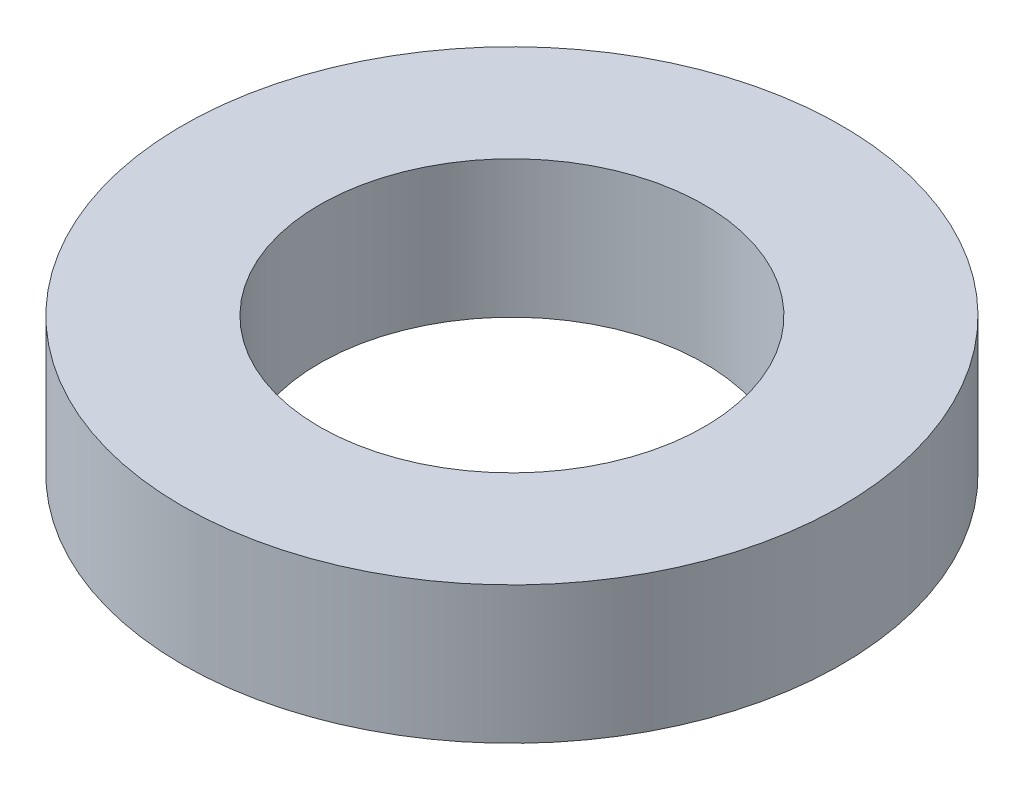
ISO-10303-21;
HEADER;
FILE_DESCRIPTION(('STEP AP214'),'2;1');
FILE_NAME('part.step','',(''),(''),'','','');
FILE_SCHEMA(('AUTOMOTIVE_DESIGN { 1 0 10303 214 1 1 1 1 }'));
ENDSEC;
DATA;
#1=APPLICATION_CONTEXT('core data for automotive mechanical design processes');
#2=APPLICATION_PROTOCOL_DEFINITION('international standard','automotive_design',2000,#1);
#3=PRODUCT_CONTEXT('',#1,'mechanical');
#4=PRODUCT('Part','Part','',(#3));
#5=PRODUCT_RELATED_PRODUCT_CATEGORY('part','',(#4));
#6=PRODUCT_DEFINITION_FORMATION('','',#4);
#7=PRODUCT_DEFINITION_CONTEXT('part definition',#1,'design');
#8=PRODUCT_DEFINITION('design','',#6,#7);
#9=PRODUCT_DEFINITION_SHAPE('','',#8);
#10=(LENGTH_UNIT() NAMED_UNIT(*) SI_UNIT(.MILLI.,.METRE.));
#11=(NAMED_UNIT(*) PLANE_ANGLE_UNIT() SI_UNIT($,.RADIAN.));
#12=(NAMED_UNIT(*) SI_UNIT($,.STERADIAN.) SOLID_ANGLE_UNIT());
#13=UNCERTAINTY_MEASURE_WITH_UNIT(LENGTH_MEASURE(1.E-05),#10,'distance_accuracy_value','');
#14=(GEOMETRIC_REPRESENTATION_CONTEXT(3) GLOBAL_UNCERTAINTY_ASSIGNED_CONTEXT((#13)) GLOBAL_UNIT_ASSIGNED_CONTEXT((#10,
#11,#12)) REPRESENTATION_CONTEXT('',''));
#15=CARTESIAN_POINT('',(0.,0.,0.));
#16=DIRECTION('',(0.,0.,1.));
#17=DIRECTION('',(1.,0.,0.));
#18=AXIS2_PLACEMENT_3D('',#15,#16,#17);
#19=CARTESIAN_POINT('',(0.,10.,0.));
#20=DIRECTION('',(0.,1.,0.));
#21=DIRECTION('',(0.,0.,1.));
#22=AXIS2_PLACEMENT_3D('',#19,#20,#21);
#23=PLANE('',#22);
#24=CARTESIAN_POINT('',(0.,10.,0.));
#25=DIRECTION('',(0.,1.,0.));
#26=DIRECTION('',(0.,0.,1.));
#27=AXIS2_PLACEMENT_3D('',#24,#25,#26);
#28=CIRCLE('',#27,24.02);
#29=CARTESIAN_POINT('',(0.,10.,24.02));
#30=VERTEX_POINT('',#29);
#31=EDGE_CURVE('E11',#30,#30,#28,.T.);
#32=ORIENTED_EDGE('',*,*,#31,.T.);
#33=EDGE_LOOP('',(#32));
#34=FACE_BOUND('',#33,.T.);
#35=CARTESIAN_POINT('',(0.,10.,0.));
#36=DIRECTION('',(0.,1.,0.));
#37=DIRECTION('',(0.,0.,1.));
#38=AXIS2_PLACEMENT_3D('',#35,#36,#37);
#39=CIRCLE('',#38,14.02);
#40=CARTESIAN_POINT('',(0.,10.,14.02));
#41=VERTEX_POINT('',#40);
#42=EDGE_CURVE('E60',#41,#41,#39,.T.);
#43=ORIENTED_EDGE('',*,*,#42,.F.);
#44=EDGE_LOOP('',(#43));
#45=FACE_BOUND('',#44,.T.);
#46=ADVANCED_FACE('F47',(#34,#45),#23,.T.);
#47=CARTESIAN_POINT('',(0.,0.,0.));
#48=DIRECTION('',(0.,1.,0.));
#49=DIRECTION('',(0.,0.,1.));
#50=AXIS2_PLACEMENT_3D('',#47,#48,#49);
#51=PLANE('',#50);
#52=CARTESIAN_POINT('',(0.,0.,0.));
#53=DIRECTION('',(0.,1.,0.));
#54=DIRECTION('',(0.,0.,1.));
#55=AXIS2_PLACEMENT_3D('',#52,#53,#54);
#56=CIRCLE('',#55,24.02);
#57=CARTESIAN_POINT('',(0.,0.,24.02));
#58=VERTEX_POINT('',#57);
#59=EDGE_CURVE('E51',#58,#58,#56,.T.);
#60=ORIENTED_EDGE('',*,*,#59,.F.);
#61=EDGE_LOOP('',(#60));
#62=FACE_BOUND('',#61,.T.);
#63=CARTESIAN_POINT('',(0.,0.,0.));
#64=DIRECTION('',(0.,1.,0.));
#65=DIRECTION('',(0.,0.,1.));
#66=AXIS2_PLACEMENT_3D('',#63,#64,#65);
#67=CIRCLE('',#66,14.02);
#68=CARTESIAN_POINT('',(0.,0.,14.02));
#69=VERTEX_POINT('',#68);
#70=EDGE_CURVE('E62',#69,#69,#67,.T.);
#71=ORIENTED_EDGE('',*,*,#70,.T.);
#72=EDGE_LOOP('',(#71));
#73=FACE_BOUND('',#72,.T.);
#74=ADVANCED_FACE('F74',(#62,#73),#51,.F.);
#75=CARTESIAN_POINT('',(0.,10.,0.));
#76=DIRECTION('',(0.,-1.,0.));
#77=DIRECTION('',(0.,0.,-1.));
#78=AXIS2_PLACEMENT_3D('',#75,#76,#77);
#79=CYLINDRICAL_SURFACE('',#78,24.02);
#80=ORIENTED_EDGE('',*,*,#31,.F.);
#81=EDGE_LOOP('',(#80));
#82=FACE_BOUND('',#81,.T.);
#83=ORIENTED_EDGE('',*,*,#59,.T.);
#84=EDGE_LOOP('',(#83));
#85=FACE_BOUND('',#84,.T.);
#86=ADVANCED_FACE('F49',(#82,#85),#79,.T.);
#87=CARTESIAN_POINT('',(0.,10.,0.));
#88=DIRECTION('',(0.,-1.,0.));
#89=DIRECTION('',(0.,0.,-1.));
#90=AXIS2_PLACEMENT_3D('',#87,#88,#89);
#91=CYLINDRICAL_SURFACE('',#90,14.02);
#92=ORIENTED_EDGE('',*,*,#42,.T.);
#93=EDGE_LOOP('',(#92));
#94=FACE_BOUND('',#93,.T.);
#95=ORIENTED_EDGE('',*,*,#70,.F.);
#96=EDGE_LOOP('',(#95));
#97=FACE_BOUND('',#96,.T.);
#98=ADVANCED_FACE('F70',(#94,#97),#91,.F.);
#99=CLOSED_SHELL('',(#46,#74,#86,#98));
#100=MANIFOLD_SOLID_BREP('B2',#99);
#101=ADVANCED_BREP_SHAPE_REPRESENTATION('',(#18,#100),#14);
#102=SHAPE_DEFINITION_REPRESENTATION(#9,#101);
ENDSEC;
END-ISO-10303-21;
